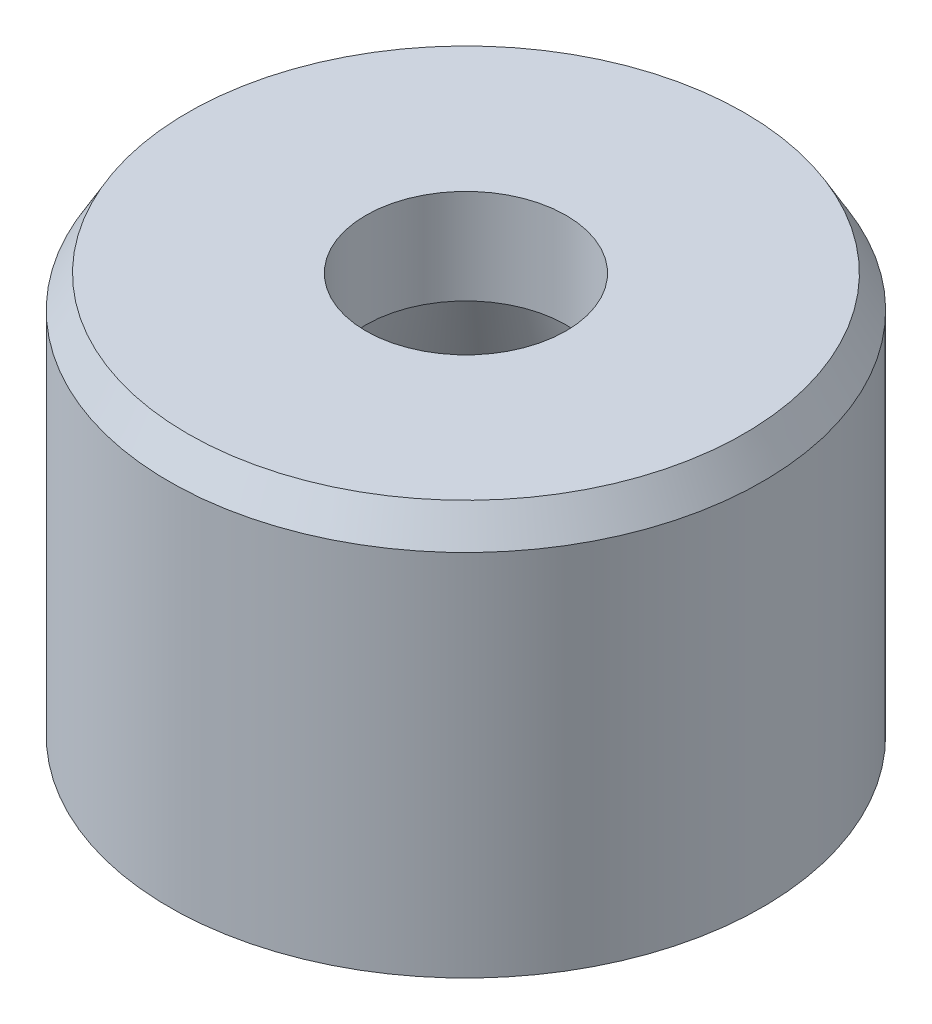
ISO-10303-21;
HEADER;
FILE_DESCRIPTION(('STEP AP214'),'2;1');
FILE_NAME('part.step','',(''),(''),'','','');
FILE_SCHEMA(('AUTOMOTIVE_DESIGN { 1 0 10303 214 1 1 1 1 }'));
ENDSEC;
DATA;
#1=APPLICATION_CONTEXT('core data for automotive mechanical design processes');
#2=APPLICATION_PROTOCOL_DEFINITION('international standard','automotive_design',2000,#1);
#3=PRODUCT_CONTEXT('',#1,'mechanical');
#4=PRODUCT('Part','Part','',(#3));
#5=PRODUCT_RELATED_PRODUCT_CATEGORY('part','',(#4));
#6=PRODUCT_DEFINITION_FORMATION('','',#4);
#7=PRODUCT_DEFINITION_CONTEXT('part definition',#1,'design');
#8=PRODUCT_DEFINITION('design','',#6,#7);
#9=PRODUCT_DEFINITION_SHAPE('','',#8);
#10=(LENGTH_UNIT() NAMED_UNIT(*) SI_UNIT(.MILLI.,.METRE.));
#11=(NAMED_UNIT(*) PLANE_ANGLE_UNIT() SI_UNIT($,.RADIAN.));
#12=(NAMED_UNIT(*) SI_UNIT($,.STERADIAN.) SOLID_ANGLE_UNIT());
#13=UNCERTAINTY_MEASURE_WITH_UNIT(LENGTH_MEASURE(1.E-05),#10,'distance_accuracy_value','');
#14=(GEOMETRIC_REPRESENTATION_CONTEXT(3) GLOBAL_UNCERTAINTY_ASSIGNED_CONTEXT((#13)) GLOBAL_UNIT_ASSIGNED_CONTEXT((#10,
#11,#12)) REPRESENTATION_CONTEXT('',''));
#15=CARTESIAN_POINT('',(0.,0.,0.));
#16=DIRECTION('',(0.,0.,1.));
#17=DIRECTION('',(1.,0.,0.));
#18=AXIS2_PLACEMENT_3D('',#15,#16,#17);
#19=CARTESIAN_POINT('',(0.,10.8,0.));
#20=DIRECTION('',(0.,1.,0.));
#21=DIRECTION('',(0.,0.,1.));
#22=AXIS2_PLACEMENT_3D('',#19,#20,#21);
#23=PLANE('',#22);
#24=CARTESIAN_POINT('',(0.,10.8,0.));
#25=DIRECTION('',(0.,1.,0.));
#26=DIRECTION('',(0.,0.,1.));
#27=AXIS2_PLACEMENT_3D('',#24,#25,#26);
#28=CIRCLE('',#27,7.49999999999999);
#29=CARTESIAN_POINT('',(0.,10.8,7.49999999999999));
#30=VERTEX_POINT('',#29);
#31=EDGE_CURVE('E39',#30,#30,#28,.T.);
#32=ORIENTED_EDGE('',*,*,#31,.T.);
#33=EDGE_LOOP('',(#32));
#34=FACE_BOUND('',#33,.T.);
#35=CARTESIAN_POINT('',(0.,10.8,0.));
#36=DIRECTION('',(0.,1.,0.));
#37=DIRECTION('',(0.,0.,1.));
#38=AXIS2_PLACEMENT_3D('',#35,#36,#37);
#39=CIRCLE('',#38,2.7);
#40=CARTESIAN_POINT('',(0.,10.8,-2.7));
#41=VERTEX_POINT('',#40);
#42=EDGE_CURVE('E55',#41,#41,#39,.T.);
#43=ORIENTED_EDGE('',*,*,#42,.F.);
#44=EDGE_LOOP('',(#43));
#45=FACE_BOUND('',#44,.T.);
#46=ADVANCED_FACE('F32',(#34,#45),#23,.T.);
#47=CARTESIAN_POINT('',(0.,0.,0.));
#48=DIRECTION('',(0.,1.,0.));
#49=DIRECTION('',(0.,0.,1.));
#50=AXIS2_PLACEMENT_3D('',#47,#48,#49);
#51=PLANE('',#50);
#52=CARTESIAN_POINT('',(0.,0.,0.));
#53=DIRECTION('',(0.,1.,0.));
#54=DIRECTION('',(0.,0.,1.));
#55=AXIS2_PLACEMENT_3D('',#52,#53,#54);
#56=CIRCLE('',#55,5.70000000000004);
#57=CARTESIAN_POINT('',(0.,0.,5.70000000000004));
#58=VERTEX_POINT('',#57);
#59=EDGE_CURVE('E47',#58,#58,#56,.T.);
#60=ORIENTED_EDGE('',*,*,#59,.T.);
#61=EDGE_LOOP('',(#60));
#62=FACE_BOUND('',#61,.T.);
#63=CARTESIAN_POINT('',(0.,0.,0.));
#64=DIRECTION('',(0.,1.,0.));
#65=DIRECTION('',(0.,0.,1.));
#66=AXIS2_PLACEMENT_3D('',#63,#64,#65);
#67=CIRCLE('',#66,8.);
#68=CARTESIAN_POINT('',(0.,0.,-8.));
#69=VERTEX_POINT('',#68);
#70=EDGE_CURVE('E52',#69,#69,#67,.T.);
#71=ORIENTED_EDGE('',*,*,#70,.F.);
#72=EDGE_LOOP('',(#71));
#73=FACE_BOUND('',#72,.T.);
#74=ADVANCED_FACE('F62',(#62,#73),#51,.F.);
#75=CARTESIAN_POINT('',(0.,10.8,0.));
#76=DIRECTION('',(0.,-1.,0.));
#77=DIRECTION('',(0.,0.,-1.));
#78=AXIS2_PLACEMENT_3D('',#75,#76,#77);
#79=CYLINDRICAL_SURFACE('',#78,8.);
#80=CARTESIAN_POINT('',(0.,9.93397459621555,0.));
#81=DIRECTION('',(0.,1.,0.));
#82=DIRECTION('',(0.,0.,1.));
#83=AXIS2_PLACEMENT_3D('',#80,#81,#82);
#84=CIRCLE('',#83,8.);
#85=CARTESIAN_POINT('',(0.,9.93397459621555,-8.));
#86=VERTEX_POINT('',#85);
#87=EDGE_CURVE('E10',#86,#86,#84,.F.);
#88=CARTESIAN_POINT('',(0.,9.93397459621555,-8.));
#89=CARTESIAN_POINT('',(0.,9.83049569417164,-8.));
#90=CARTESIAN_POINT('',(0.,9.72701679212773,-8.));
#91=CARTESIAN_POINT('',(0.,9.5200589880399,-8.));
#92=CARTESIAN_POINT('',(0.,9.41658008599599,-8.));
#93=CARTESIAN_POINT('',(0.,9.20962228190817,-8.));
#94=CARTESIAN_POINT('',(0.,9.10614337986426,-8.));
#95=CARTESIAN_POINT('',(0.,8.89918557577643,-8.));
#96=CARTESIAN_POINT('',(0.,8.79570667373252,-8.));
#97=CARTESIAN_POINT('',(0.,8.58874886964469,-8.));
#98=CARTESIAN_POINT('',(0.,8.48526996760078,-8.));
#99=CARTESIAN_POINT('',(0.,8.27831216351296,-8.));
#100=CARTESIAN_POINT('',(0.,8.17483326146905,-8.));
#101=CARTESIAN_POINT('',(0.,7.96787545738122,-8.));
#102=CARTESIAN_POINT('',(0.,7.86439655533731,-8.));
#103=CARTESIAN_POINT('',(0.,7.65743875124949,-8.));
#104=CARTESIAN_POINT('',(0.,7.55395984920557,-8.));
#105=CARTESIAN_POINT('',(0.,7.34700204511775,-8.));
#106=CARTESIAN_POINT('',(0.,7.24352314307384,-8.));
#107=CARTESIAN_POINT('',(0.,7.03656533898601,-8.));
#108=CARTESIAN_POINT('',(0.,6.9330864369421,-8.));
#109=CARTESIAN_POINT('',(0.,6.72612863285428,-8.));
#110=CARTESIAN_POINT('',(0.,6.62264973081037,-8.));
#111=CARTESIAN_POINT('',(0.,6.41569192672254,-8.));
#112=CARTESIAN_POINT('',(0.,6.31221302467863,-8.));
#113=CARTESIAN_POINT('',(0.,6.10525522059081,-8.));
#114=CARTESIAN_POINT('',(0.,6.0017763185469,-8.));
#115=CARTESIAN_POINT('',(0.,5.79481851445907,-8.));
#116=CARTESIAN_POINT('',(0.,5.69133961241516,-8.));
#117=CARTESIAN_POINT('',(0.,5.48438180832733,-8.));
#118=CARTESIAN_POINT('',(0.,5.38090290628342,-8.));
#119=CARTESIAN_POINT('',(0.,5.1739451021956,-8.));
#120=CARTESIAN_POINT('',(0.,5.07046620015169,-8.));
#121=CARTESIAN_POINT('',(0.,4.86350839606386,-8.));
#122=CARTESIAN_POINT('',(0.,4.76002949401995,-8.));
#123=CARTESIAN_POINT('',(0.,4.55307168993213,-8.));
#124=CARTESIAN_POINT('',(0.,4.44959278788821,-8.));
#125=CARTESIAN_POINT('',(0.,4.24263498380039,-8.));
#126=CARTESIAN_POINT('',(0.,4.13915608175648,-8.));
#127=CARTESIAN_POINT('',(0.,3.93219827766865,-8.));
#128=CARTESIAN_POINT('',(0.,3.82871937562474,-8.));
#129=CARTESIAN_POINT('',(0.,3.62176157153692,-8.));
#130=CARTESIAN_POINT('',(0.,3.51828266949301,-8.));
#131=CARTESIAN_POINT('',(0.,3.31132486540518,-8.));
#132=CARTESIAN_POINT('',(0.,3.20784596336127,-8.));
#133=CARTESIAN_POINT('',(0.,3.00088815927345,-8.));
#134=CARTESIAN_POINT('',(0.,2.89740925722953,-8.));
#135=CARTESIAN_POINT('',(0.,2.69045145314171,-8.));
#136=CARTESIAN_POINT('',(0.,2.5869725510978,-8.));
#137=CARTESIAN_POINT('',(0.,2.38001474700997,-8.));
#138=CARTESIAN_POINT('',(0.,2.27653584496606,-8.));
#139=CARTESIAN_POINT('',(0.,2.06957804087824,-8.));
#140=CARTESIAN_POINT('',(0.,1.96609913883433,-8.));
#141=CARTESIAN_POINT('',(0.,1.7591413347465,-8.));
#142=CARTESIAN_POINT('',(0.,1.65566243270259,-8.));
#143=CARTESIAN_POINT('',(0.,1.44870462861477,-8.));
#144=CARTESIAN_POINT('',(0.,1.34522572657085,-8.));
#145=CARTESIAN_POINT('',(0.,1.13826792248303,-8.));
#146=CARTESIAN_POINT('',(0.,1.03478902043912,-8.));
#147=CARTESIAN_POINT('',(0.,0.827831216351294,-8.));
#148=CARTESIAN_POINT('',(0.,0.724352314307383,-8.));
#149=CARTESIAN_POINT('',(0.,0.517394510219559,-8.));
#150=CARTESIAN_POINT('',(0.,0.413915608175646,-8.));
#151=CARTESIAN_POINT('',(0.,0.206957804087822,-8.));
#152=CARTESIAN_POINT('',(0.,0.10347890204391,-8.));
#153=CARTESIAN_POINT('',(0.,0.,-8.));
#154=B_SPLINE_CURVE_WITH_KNOTS('',3,(#88,#89,#90,#91,#92,#93,#94,#95,#96,#97,#98,#99,#100,#101,
#102,#103,#104,#105,#106,#107,#108,#109,#110,#111,#112,#113,#114,#115,#116,#117,#118,#119,#120,
#121,#122,#123,#124,#125,#126,#127,#128,#129,#130,#131,#132,#133,#134,#135,#136,#137,#138,#139,
#140,#141,#142,#143,#144,#145,#146,#147,#148,#149,#150,#151,#152,#153),.UNSPECIFIED.,.F.,.F.,(4,
2,2,2,2,2,2,2,2,2,2,2,2,2,2,2,2,2,2,2,2,2,2,2,2,2,2,2,2,2,2,2,4),(0.,0.310436706131735,
0.620873412263471,0.931310118395206,1.24174682452694,1.55218353065868,1.86262023679041,
2.17305694292215,2.48349364905389,2.79393035518562,3.10436706131736,3.41480376744909,
3.72524047358083,4.03567717971257,4.3461138858443,4.65655059197604,4.96698729810777,
5.27742400423951,5.58786071037125,5.89829741650298,6.20873412263472,6.51917082876645,
6.82960753489819,7.14004424102993,7.45048094716166,7.7609176532934,8.07135435942513,
8.38179106555687,8.69222777168861,9.00266447782034,9.31310118395208,9.62353789008382,
9.93397459621555),.UNSPECIFIED.);
#155=EDGE_CURVE('BSEAM67',#86,#69,#154,.T.);
#156=ORIENTED_EDGE('',*,*,#87,.T.);
#157=ORIENTED_EDGE('',*,*,#70,.T.);
#158=ORIENTED_EDGE('',*,*,#155,.T.);
#159=ORIENTED_EDGE('',*,*,#155,.F.);
#160=EDGE_LOOP('',(#156,#158,#157,#159));
#161=FACE_BOUND('',#160,.T.);
#162=ADVANCED_FACE('F67',(#161),#79,.T.);
#163=CARTESIAN_POINT('',(0.,10.8,0.));
#164=DIRECTION('',(0.,-1.,0.));
#165=DIRECTION('',(0.,0.,-1.));
#166=AXIS2_PLACEMENT_3D('',#163,#164,#165);
#167=CYLINDRICAL_SURFACE('',#166,2.7);
#168=CARTESIAN_POINT('',(0.,8.24243225836395,0.));
#169=DIRECTION('',(0.,1.,0.));
#170=DIRECTION('',(0.,0.,1.));
#171=AXIS2_PLACEMENT_3D('',#168,#169,#170);
#172=CIRCLE('',#171,2.7);
#173=CARTESIAN_POINT('',(0.,8.24243225836395,-2.7));
#174=VERTEX_POINT('',#173);
#175=EDGE_CURVE('E43',#174,#174,#172,.F.);
#176=CARTESIAN_POINT('',(0.,8.24243225836395,-2.7));
#177=CARTESIAN_POINT('',(0.,8.26907358900599,-2.7));
#178=CARTESIAN_POINT('',(0.,8.29571491964803,-2.7));
#179=CARTESIAN_POINT('',(0.,8.34899758093212,-2.7));
#180=CARTESIAN_POINT('',(0.,8.37563891157416,-2.7));
#181=CARTESIAN_POINT('',(0.,8.42892157285824,-2.7));
#182=CARTESIAN_POINT('',(0.,8.45556290350028,-2.7));
#183=CARTESIAN_POINT('',(0.,8.50884556478437,-2.7));
#184=CARTESIAN_POINT('',(0.,8.53548689542641,-2.7));
#185=CARTESIAN_POINT('',(0.,8.5887695567105,-2.7));
#186=CARTESIAN_POINT('',(0.,8.61541088735254,-2.7));
#187=CARTESIAN_POINT('',(0.,8.66869354863662,-2.7));
#188=CARTESIAN_POINT('',(0.,8.69533487927866,-2.7));
#189=CARTESIAN_POINT('',(0.,8.74861754056275,-2.7));
#190=CARTESIAN_POINT('',(0.,8.77525887120479,-2.7));
#191=CARTESIAN_POINT('',(0.,8.82854153248888,-2.7));
#192=CARTESIAN_POINT('',(0.,8.85518286313092,-2.7));
#193=CARTESIAN_POINT('',(0.,8.908465524415,-2.7));
#194=CARTESIAN_POINT('',(0.,8.93510685505704,-2.7));
#195=CARTESIAN_POINT('',(0.,8.98838951634113,-2.7));
#196=CARTESIAN_POINT('',(0.,9.01503084698317,-2.7));
#197=CARTESIAN_POINT('',(0.,9.06831350826726,-2.7));
#198=CARTESIAN_POINT('',(0.,9.0949548389093,-2.7));
#199=CARTESIAN_POINT('',(0.,9.14823750019338,-2.7));
#200=CARTESIAN_POINT('',(0.,9.17487883083542,-2.7));
#201=CARTESIAN_POINT('',(0.,9.22816149211951,-2.7));
#202=CARTESIAN_POINT('',(0.,9.25480282276155,-2.7));
#203=CARTESIAN_POINT('',(0.,9.30808548404564,-2.7));
#204=CARTESIAN_POINT('',(0.,9.33472681468768,-2.7));
#205=CARTESIAN_POINT('',(0.,9.38800947597176,-2.7));
#206=CARTESIAN_POINT('',(0.,9.4146508066138,-2.7));
#207=CARTESIAN_POINT('',(0.,9.46793346789789,-2.7));
#208=CARTESIAN_POINT('',(0.,9.49457479853993,-2.7));
#209=CARTESIAN_POINT('',(0.,9.54785745982402,-2.7));
#210=CARTESIAN_POINT('',(0.,9.57449879046606,-2.7));
#211=CARTESIAN_POINT('',(0.,9.62778145175014,-2.7));
#212=CARTESIAN_POINT('',(0.,9.65442278239219,-2.7));
#213=CARTESIAN_POINT('',(0.,9.70770544367627,-2.7));
#214=CARTESIAN_POINT('',(0.,9.73434677431831,-2.7));
#215=CARTESIAN_POINT('',(0.,9.7876294356024,-2.7));
#216=CARTESIAN_POINT('',(0.,9.81427076624444,-2.7));
#217=CARTESIAN_POINT('',(0.,9.86755342752852,-2.7));
#218=CARTESIAN_POINT('',(0.,9.89419475817057,-2.7));
#219=CARTESIAN_POINT('',(0.,9.94747741945465,-2.7));
#220=CARTESIAN_POINT('',(0.,9.97411875009669,-2.7));
#221=CARTESIAN_POINT('',(0.,10.0274014113808,-2.7));
#222=CARTESIAN_POINT('',(0.,10.0540427420228,-2.7));
#223=CARTESIAN_POINT('',(0.,10.1073254033069,-2.7));
#224=CARTESIAN_POINT('',(0.,10.1339667339489,-2.7));
#225=CARTESIAN_POINT('',(0.,10.187249395233,-2.7));
#226=CARTESIAN_POINT('',(0.,10.2138907258751,-2.7));
#227=CARTESIAN_POINT('',(0.,10.2671733871592,-2.7));
#228=CARTESIAN_POINT('',(0.,10.2938147178012,-2.7));
#229=CARTESIAN_POINT('',(0.,10.3470973790853,-2.7));
#230=CARTESIAN_POINT('',(0.,10.3737387097273,-2.7));
#231=CARTESIAN_POINT('',(0.,10.4270213710114,-2.7));
#232=CARTESIAN_POINT('',(0.,10.4536627016535,-2.7));
#233=CARTESIAN_POINT('',(0.,10.5069453629375,-2.7));
#234=CARTESIAN_POINT('',(0.,10.5335866935796,-2.7));
#235=CARTESIAN_POINT('',(0.,10.5868693548637,-2.7));
#236=CARTESIAN_POINT('',(0.,10.6135106855057,-2.7));
#237=CARTESIAN_POINT('',(0.,10.6667933467898,-2.7));
#238=CARTESIAN_POINT('',(0.,10.6934346774318,-2.7));
#239=CARTESIAN_POINT('',(0.,10.7467173387159,-2.7));
#240=CARTESIAN_POINT('',(0.,10.773358669358,-2.7));
#241=CARTESIAN_POINT('',(0.,10.8,-2.7));
#242=B_SPLINE_CURVE_WITH_KNOTS('',3,(#176,#177,#178,#179,#180,#181,#182,#183,#184,#185,#186,
#187,#188,#189,#190,#191,#192,#193,#194,#195,#196,#197,#198,#199,#200,#201,#202,#203,#204,#205,
#206,#207,#208,#209,#210,#211,#212,#213,#214,#215,#216,#217,#218,#219,#220,#221,#222,#223,#224,
#225,#226,#227,#228,#229,#230,#231,#232,#233,#234,#235,#236,#237,#238,#239,#240,#241),
.UNSPECIFIED.,.F.,.F.,(4,2,2,2,2,2,2,2,2,2,2,2,2,2,2,2,2,2,2,2,2,2,2,2,2,2,2,2,2,2,2,2,4),(0.,
0.0799239919261254,0.159847983852253,0.23977197577838,0.319695967704507,0.399619959630632,
0.479543951556759,0.559467943482887,0.639391935409012,0.719315927335139,0.799239919261266,
0.879163911187393,0.959087903113519,1.03901189503965,1.11893588696577,1.1988598788919,
1.27878387081803,1.35870786274415,1.43863185467028,1.51855584659641,1.59847983852253,
1.67840383044866,1.75832782237479,1.83825181430091,1.91817580622704,1.99809979815317,
2.07802379007929,2.15794778200542,2.23787177393155,2.31779576585767,2.3977197577838,
2.47764374970993,2.55756774163605),.UNSPECIFIED.);
#243=EDGE_CURVE('BSEAM59',#174,#41,#242,.T.);
#244=ORIENTED_EDGE('',*,*,#175,.T.);
#245=ORIENTED_EDGE('',*,*,#42,.T.);
#246=ORIENTED_EDGE('',*,*,#243,.T.);
#247=ORIENTED_EDGE('',*,*,#243,.F.);
#248=EDGE_LOOP('',(#244,#246,#245,#247));
#249=FACE_BOUND('',#248,.T.);
#250=ADVANCED_FACE('F59',(#249),#167,.F.);
#251=CARTESIAN_POINT('',(0.,0.,0.));
#252=DIRECTION('',(0.,-1.,0.));
#253=DIRECTION('',(0.,0.,-1.));
#254=AXIS2_PLACEMENT_3D('',#251,#252,#253);
#255=CONICAL_SURFACE('',#254,5.70000000000004,0.349065850398867);
#256=ORIENTED_EDGE('',*,*,#175,.F.);
#257=EDGE_LOOP('',(#256));
#258=FACE_BOUND('',#257,.T.);
#259=ORIENTED_EDGE('',*,*,#59,.F.);
#260=EDGE_LOOP('',(#259));
#261=FACE_BOUND('',#260,.T.);
#262=ADVANCED_FACE('F73',(#258,#261),#255,.F.);
#263=CARTESIAN_POINT('',(0.,10.8,0.));
#264=DIRECTION('',(0.,-1.,0.));
#265=DIRECTION('',(0.,0.,-1.));
#266=AXIS2_PLACEMENT_3D('',#263,#264,#265);
#267=CONICAL_SURFACE('',#266,7.49999999999999,0.5235987755983);
#268=ORIENTED_EDGE('',*,*,#87,.F.);
#269=EDGE_LOOP('',(#268));
#270=FACE_BOUND('',#269,.T.);
#271=ORIENTED_EDGE('',*,*,#31,.F.);
#272=EDGE_LOOP('',(#271));
#273=FACE_BOUND('',#272,.T.);
#274=ADVANCED_FACE('F34',(#270,#273),#267,.T.);
#275=CLOSED_SHELL('',(#46,#74,#162,#250,#262,#274));
#276=MANIFOLD_SOLID_BREP('B2',#275);
#277=ADVANCED_BREP_SHAPE_REPRESENTATION('',(#18,#276),#14);
#278=SHAPE_DEFINITION_REPRESENTATION(#9,#277);
ENDSEC;
END-ISO-10303-21;
